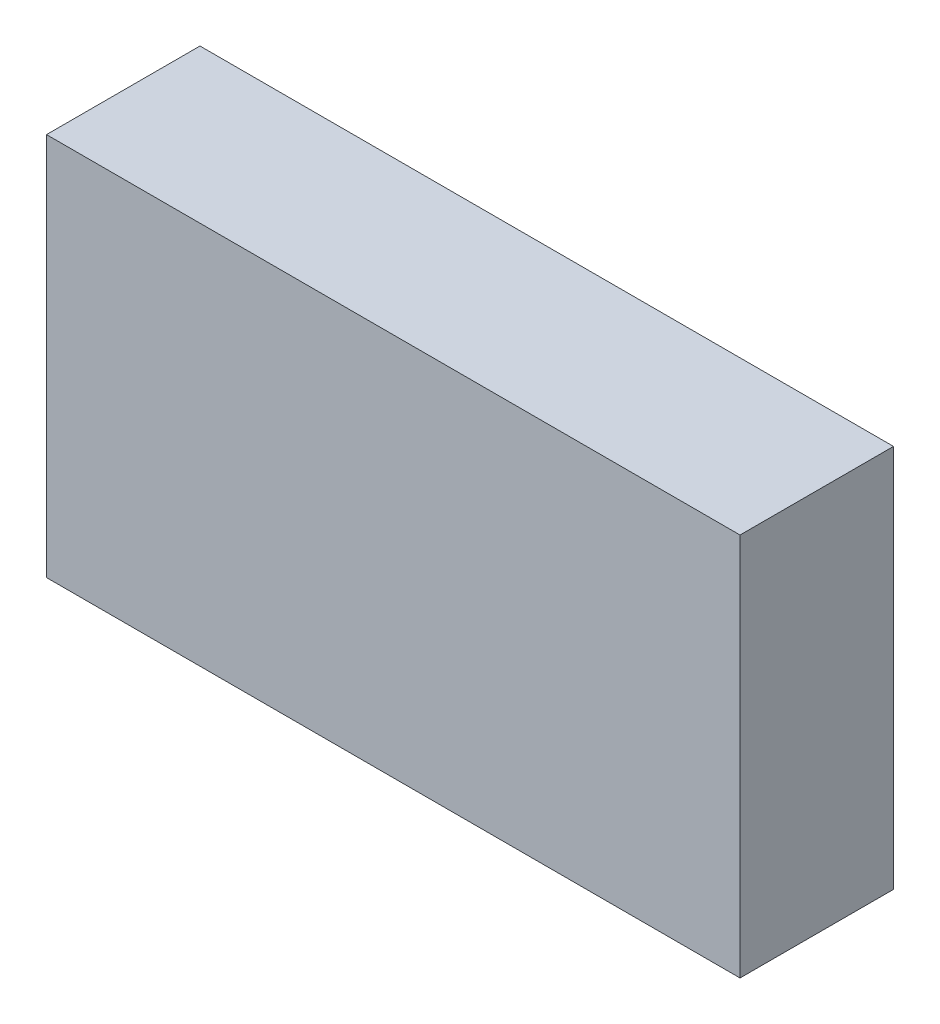
ISO-10303-21;
HEADER;
FILE_DESCRIPTION(('STEP AP214'),'2;1');
FILE_NAME('part.step','',(''),(''),'','','');
FILE_SCHEMA(('AUTOMOTIVE_DESIGN { 1 0 10303 214 1 1 1 1 }'));
ENDSEC;
DATA;
#1=APPLICATION_CONTEXT('core data for automotive mechanical design processes');
#2=APPLICATION_PROTOCOL_DEFINITION('international standard','automotive_design',2000,#1);
#3=PRODUCT_CONTEXT('',#1,'mechanical');
#4=PRODUCT('Part','Part','',(#3));
#5=PRODUCT_RELATED_PRODUCT_CATEGORY('part','',(#4));
#6=PRODUCT_DEFINITION_FORMATION('','',#4);
#7=PRODUCT_DEFINITION_CONTEXT('part definition',#1,'design');
#8=PRODUCT_DEFINITION('design','',#6,#7);
#9=PRODUCT_DEFINITION_SHAPE('','',#8);
#10=(LENGTH_UNIT() NAMED_UNIT(*) SI_UNIT(.MILLI.,.METRE.));
#11=(NAMED_UNIT(*) PLANE_ANGLE_UNIT() SI_UNIT($,.RADIAN.));
#12=(NAMED_UNIT(*) SI_UNIT($,.STERADIAN.) SOLID_ANGLE_UNIT());
#13=UNCERTAINTY_MEASURE_WITH_UNIT(LENGTH_MEASURE(1.E-05),#10,'distance_accuracy_value','');
#14=(GEOMETRIC_REPRESENTATION_CONTEXT(3) GLOBAL_UNCERTAINTY_ASSIGNED_CONTEXT((#13)) GLOBAL_UNIT_ASSIGNED_CONTEXT((#10,
#11,#12)) REPRESENTATION_CONTEXT('',''));
#15=CARTESIAN_POINT('',(0.,0.,0.));
#16=DIRECTION('',(0.,0.,1.));
#17=DIRECTION('',(1.,0.,0.));
#18=AXIS2_PLACEMENT_3D('',#15,#16,#17);
#19=CARTESIAN_POINT('',(117.5,-65.,26.));
#20=DIRECTION('',(-1.,0.,0.));
#21=DIRECTION('',(0.,0.,1.));
#22=AXIS2_PLACEMENT_3D('',#19,#20,#21);
#23=PLANE('',#22);
#24=DIRECTION('',(0.,1.,0.));
#25=VECTOR('',#24,1.);
#26=CARTESIAN_POINT('',(117.5,-65.,-26.));
#27=LINE('',#26,#25);
#28=CARTESIAN_POINT('',(117.5,-65.,-26.));
#29=VERTEX_POINT('',#28);
#30=CARTESIAN_POINT('',(117.5,65.,-26.));
#31=VERTEX_POINT('',#30);
#32=EDGE_CURVE('E111',#29,#31,#27,.T.);
#33=ORIENTED_EDGE('',*,*,#32,.T.);
#34=DIRECTION('',(0.,0.,-1.));
#35=VECTOR('',#34,1.);
#36=CARTESIAN_POINT('',(117.5,65.,26.));
#37=LINE('',#36,#35);
#38=CARTESIAN_POINT('',(117.5,65.,26.));
#39=VERTEX_POINT('',#38);
#40=EDGE_CURVE('E11',#39,#31,#37,.T.);
#41=ORIENTED_EDGE('',*,*,#40,.F.);
#42=DIRECTION('',(0.,1.,0.));
#43=VECTOR('',#42,1.);
#44=CARTESIAN_POINT('',(117.5,-65.,26.));
#45=LINE('',#44,#43);
#46=CARTESIAN_POINT('',(117.5,-65.,26.));
#47=VERTEX_POINT('',#46);
#48=EDGE_CURVE('E95',#47,#39,#45,.T.);
#49=ORIENTED_EDGE('',*,*,#48,.F.);
#50=DIRECTION('',(0.,0.,-1.));
#51=VECTOR('',#50,1.);
#52=CARTESIAN_POINT('',(117.5,-65.,26.));
#53=LINE('',#52,#51);
#54=EDGE_CURVE('E107',#47,#29,#53,.T.);
#55=ORIENTED_EDGE('',*,*,#54,.T.);
#56=EDGE_LOOP('',(#33,#41,#49,#55));
#57=FACE_BOUND('',#56,.T.);
#58=ADVANCED_FACE('F43',(#57),#23,.F.);
#59=CARTESIAN_POINT('',(-117.5,65.,26.));
#60=DIRECTION('',(0.,-1.,0.));
#61=DIRECTION('',(0.,0.,-1.));
#62=AXIS2_PLACEMENT_3D('',#59,#60,#61);
#63=PLANE('',#62);
#64=DIRECTION('',(-1.,0.,0.));
#65=VECTOR('',#64,1.);
#66=CARTESIAN_POINT('',(-117.5,65.,-26.));
#67=LINE('',#66,#65);
#68=CARTESIAN_POINT('',(-117.5,65.,-26.));
#69=VERTEX_POINT('',#68);
#70=EDGE_CURVE('E100',#31,#69,#67,.T.);
#71=ORIENTED_EDGE('',*,*,#70,.T.);
#72=DIRECTION('',(0.,0.,-1.));
#73=VECTOR('',#72,1.);
#74=CARTESIAN_POINT('',(-117.5,65.,26.));
#75=LINE('',#74,#73);
#76=CARTESIAN_POINT('',(-117.5,65.,26.));
#77=VERTEX_POINT('',#76);
#78=EDGE_CURVE('E52',#77,#69,#75,.T.);
#79=ORIENTED_EDGE('',*,*,#78,.F.);
#80=DIRECTION('',(-1.,0.,0.));
#81=VECTOR('',#80,1.);
#82=CARTESIAN_POINT('',(-117.5,65.,26.));
#83=LINE('',#82,#81);
#84=EDGE_CURVE('E90',#39,#77,#83,.T.);
#85=ORIENTED_EDGE('',*,*,#84,.F.);
#86=ORIENTED_EDGE('',*,*,#40,.T.);
#87=EDGE_LOOP('',(#71,#79,#85,#86));
#88=FACE_BOUND('',#87,.T.);
#89=ADVANCED_FACE('F99',(#88),#63,.F.);
#90=CARTESIAN_POINT('',(-117.5,-65.,26.));
#91=DIRECTION('',(1.,0.,0.));
#92=DIRECTION('',(0.,0.,-1.));
#93=AXIS2_PLACEMENT_3D('',#90,#91,#92);
#94=PLANE('',#93);
#95=DIRECTION('',(0.,-1.,0.));
#96=VECTOR('',#95,1.);
#97=CARTESIAN_POINT('',(-117.5,-65.,-26.));
#98=LINE('',#97,#96);
#99=CARTESIAN_POINT('',(-117.5,-65.,-26.));
#100=VERTEX_POINT('',#99);
#101=EDGE_CURVE('E77',#69,#100,#98,.T.);
#102=ORIENTED_EDGE('',*,*,#101,.T.);
#103=DIRECTION('',(0.,0.,-1.));
#104=VECTOR('',#103,1.);
#105=CARTESIAN_POINT('',(-117.5,-65.,26.));
#106=LINE('',#105,#104);
#107=CARTESIAN_POINT('',(-117.5,-65.,26.));
#108=VERTEX_POINT('',#107);
#109=EDGE_CURVE('E102',#108,#100,#106,.T.);
#110=ORIENTED_EDGE('',*,*,#109,.F.);
#111=DIRECTION('',(0.,-1.,0.));
#112=VECTOR('',#111,1.);
#113=CARTESIAN_POINT('',(-117.5,-65.,26.));
#114=LINE('',#113,#112);
#115=EDGE_CURVE('E93',#77,#108,#114,.T.);
#116=ORIENTED_EDGE('',*,*,#115,.F.);
#117=ORIENTED_EDGE('',*,*,#78,.T.);
#118=EDGE_LOOP('',(#102,#110,#116,#117));
#119=FACE_BOUND('',#118,.T.);
#120=ADVANCED_FACE('F103',(#119),#94,.F.);
#121=CARTESIAN_POINT('',(-117.5,-65.,26.));
#122=DIRECTION('',(0.,1.,0.));
#123=DIRECTION('',(0.,0.,1.));
#124=AXIS2_PLACEMENT_3D('',#121,#122,#123);
#125=PLANE('',#124);
#126=DIRECTION('',(1.,0.,0.));
#127=VECTOR('',#126,1.);
#128=CARTESIAN_POINT('',(-117.5,-65.,-26.));
#129=LINE('',#128,#127);
#130=EDGE_CURVE('E83',#100,#29,#129,.T.);
#131=ORIENTED_EDGE('',*,*,#130,.T.);
#132=ORIENTED_EDGE('',*,*,#54,.F.);
#133=DIRECTION('',(1.,0.,0.));
#134=VECTOR('',#133,1.);
#135=CARTESIAN_POINT('',(-117.5,-65.,26.));
#136=LINE('',#135,#134);
#137=EDGE_CURVE('E60',#108,#47,#136,.T.);
#138=ORIENTED_EDGE('',*,*,#137,.F.);
#139=ORIENTED_EDGE('',*,*,#109,.T.);
#140=EDGE_LOOP('',(#131,#132,#138,#139));
#141=FACE_BOUND('',#140,.T.);
#142=ADVANCED_FACE('F124',(#141),#125,.F.);
#143=CARTESIAN_POINT('',(0.,0.,26.));
#144=DIRECTION('',(0.,0.,-1.));
#145=DIRECTION('',(-1.,0.,0.));
#146=AXIS2_PLACEMENT_3D('',#143,#144,#145);
#147=PLANE('',#146);
#148=ORIENTED_EDGE('',*,*,#48,.T.);
#149=ORIENTED_EDGE('',*,*,#84,.T.);
#150=ORIENTED_EDGE('',*,*,#115,.T.);
#151=ORIENTED_EDGE('',*,*,#137,.T.);
#152=EDGE_LOOP('',(#148,#149,#150,#151));
#153=FACE_BOUND('',#152,.T.);
#154=ADVANCED_FACE('F91',(#153),#147,.F.);
#155=CARTESIAN_POINT('',(0.,0.,-26.));
#156=DIRECTION('',(0.,0.,-1.));
#157=DIRECTION('',(-1.,0.,0.));
#158=AXIS2_PLACEMENT_3D('',#155,#156,#157);
#159=PLANE('',#158);
#160=ORIENTED_EDGE('',*,*,#32,.F.);
#161=ORIENTED_EDGE('',*,*,#130,.F.);
#162=ORIENTED_EDGE('',*,*,#101,.F.);
#163=ORIENTED_EDGE('',*,*,#70,.F.);
#164=EDGE_LOOP('',(#160,#161,#162,#163));
#165=FACE_BOUND('',#164,.T.);
#166=ADVANCED_FACE('F127',(#165),#159,.T.);
#167=CLOSED_SHELL('',(#58,#89,#120,#142,#154,#166));
#168=MANIFOLD_SOLID_BREP('B2',#167);
#169=ADVANCED_BREP_SHAPE_REPRESENTATION('',(#18,#168),#14);
#170=SHAPE_DEFINITION_REPRESENTATION(#9,#169);
ENDSEC;
END-ISO-10303-21;
